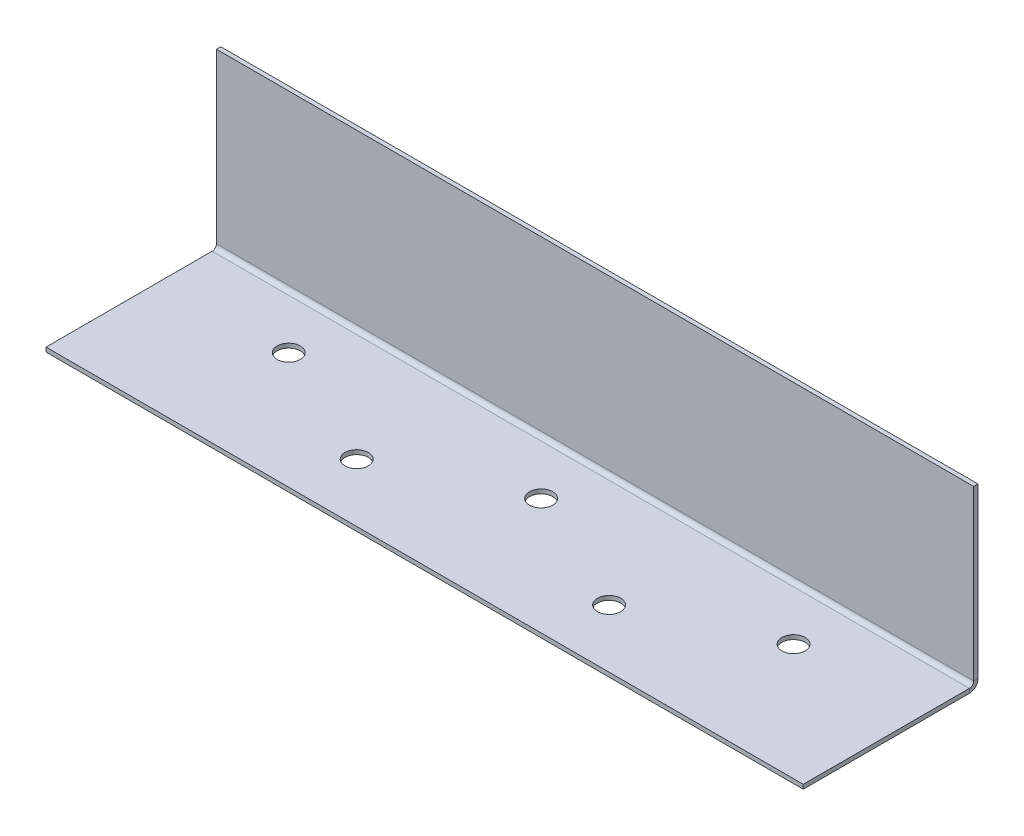
ISO-10303-21;
HEADER;
FILE_DESCRIPTION(('STEP AP214'),'2;1');
FILE_NAME('part.step','',(''),(''),'','','');
FILE_SCHEMA(('AUTOMOTIVE_DESIGN { 1 0 10303 214 1 1 1 1 }'));
ENDSEC;
DATA;
#1=APPLICATION_CONTEXT('core data for automotive mechanical design processes');
#2=APPLICATION_PROTOCOL_DEFINITION('international standard','automotive_design',2000,#1);
#3=PRODUCT_CONTEXT('',#1,'mechanical');
#4=PRODUCT('Part','Part','',(#3));
#5=PRODUCT_RELATED_PRODUCT_CATEGORY('part','',(#4));
#6=PRODUCT_DEFINITION_FORMATION('','',#4);
#7=PRODUCT_DEFINITION_CONTEXT('part definition',#1,'design');
#8=PRODUCT_DEFINITION('design','',#6,#7);
#9=PRODUCT_DEFINITION_SHAPE('','',#8);
#10=(LENGTH_UNIT() NAMED_UNIT(*) SI_UNIT(.MILLI.,.METRE.));
#11=(NAMED_UNIT(*) PLANE_ANGLE_UNIT() SI_UNIT($,.RADIAN.));
#12=(NAMED_UNIT(*) SI_UNIT($,.STERADIAN.) SOLID_ANGLE_UNIT());
#13=UNCERTAINTY_MEASURE_WITH_UNIT(LENGTH_MEASURE(1.E-05),#10,'distance_accuracy_value','');
#14=(GEOMETRIC_REPRESENTATION_CONTEXT(3) GLOBAL_UNCERTAINTY_ASSIGNED_CONTEXT((#13)) GLOBAL_UNIT_ASSIGNED_CONTEXT((#10,
#11,#12)) REPRESENTATION_CONTEXT('',''));
#15=CARTESIAN_POINT('',(0.,0.,0.));
#16=DIRECTION('',(0.,0.,1.));
#17=DIRECTION('',(1.,0.,0.));
#18=AXIS2_PLACEMENT_3D('',#15,#16,#17);
#19=CARTESIAN_POINT('',(-65.,-0.7366,15.));
#20=DIRECTION('',(-1.,0.,0.));
#21=DIRECTION('',(0.,0.,1.));
#22=AXIS2_PLACEMENT_3D('',#19,#20,#21);
#23=PLANE('',#22);
#24=DIRECTION('',(0.,0.,1.));
#25=VECTOR('',#24,1.);
#26=CARTESIAN_POINT('',(-65.,0.,15.));
#27=LINE('',#26,#25);
#28=CARTESIAN_POINT('',(-65.,0.,-13.5268));
#29=VERTEX_POINT('',#28);
#30=CARTESIAN_POINT('',(-65.,0.,15.));
#31=VERTEX_POINT('',#30);
#32=EDGE_CURVE('E105',#29,#31,#27,.T.);
#33=ORIENTED_EDGE('',*,*,#32,.F.);
#34=DIRECTION('',(0.,-1.,0.));
#35=VECTOR('',#34,1.);
#36=CARTESIAN_POINT('',(-65.,0.,-13.5268));
#37=LINE('',#36,#35);
#38=CARTESIAN_POINT('',(-65.,-0.736600000000003,-13.5268));
#39=VERTEX_POINT('',#38);
#40=EDGE_CURVE('E148',#29,#39,#37,.T.);
#41=ORIENTED_EDGE('',*,*,#40,.T.);
#42=DIRECTION('',(0.,0.,1.));
#43=VECTOR('',#42,1.);
#44=CARTESIAN_POINT('',(-65.,-0.7366,15.));
#45=LINE('',#44,#43);
#46=CARTESIAN_POINT('',(-65.,-0.7366,15.));
#47=VERTEX_POINT('',#46);
#48=EDGE_CURVE('E113',#39,#47,#45,.T.);
#49=ORIENTED_EDGE('',*,*,#48,.T.);
#50=DIRECTION('',(0.,1.,0.));
#51=VECTOR('',#50,1.);
#52=CARTESIAN_POINT('',(-65.,-0.7366,15.));
#53=LINE('',#52,#51);
#54=EDGE_CURVE('E61',#47,#31,#53,.T.);
#55=ORIENTED_EDGE('',*,*,#54,.T.);
#56=EDGE_LOOP('',(#33,#41,#49,#55));
#57=FACE_BOUND('',#56,.T.);
#58=ADVANCED_FACE('F57',(#57),#23,.T.);
#59=CARTESIAN_POINT('',(0.,-0.7366,0.));
#60=DIRECTION('',(0.,-1.,0.));
#61=DIRECTION('',(0.,0.,-1.));
#62=AXIS2_PLACEMENT_3D('',#59,#60,#61);
#63=PLANE('',#62);
#64=CARTESIAN_POINT('',(0.,-0.7366,-5.));
#65=DIRECTION('',(0.,1.,0.));
#66=DIRECTION('',(0.,0.,1.));
#67=AXIS2_PLACEMENT_3D('',#64,#65,#66);
#68=CIRCLE('',#67,2.);
#69=CARTESIAN_POINT('',(0.,-0.7366,-3.));
#70=VERTEX_POINT('',#69);
#71=EDGE_CURVE('E106',#70,#70,#68,.T.);
#72=ORIENTED_EDGE('',*,*,#71,.T.);
#73=EDGE_LOOP('',(#72));
#74=FACE_BOUND('',#73,.T.);
#75=CARTESIAN_POINT('',(-21.6666666666667,-0.7366,5.));
#76=DIRECTION('',(0.,1.,0.));
#77=DIRECTION('',(0.,0.,1.));
#78=AXIS2_PLACEMENT_3D('',#75,#76,#77);
#79=CIRCLE('',#78,2.);
#80=CARTESIAN_POINT('',(-21.6666666666667,-0.7366,7.));
#81=VERTEX_POINT('',#80);
#82=EDGE_CURVE('E122',#81,#81,#79,.T.);
#83=ORIENTED_EDGE('',*,*,#82,.T.);
#84=EDGE_LOOP('',(#83));
#85=FACE_BOUND('',#84,.T.);
#86=CARTESIAN_POINT('',(-43.3333333333333,-0.7366,-5.));
#87=DIRECTION('',(0.,1.,0.));
#88=DIRECTION('',(0.,0.,1.));
#89=AXIS2_PLACEMENT_3D('',#86,#87,#88);
#90=CIRCLE('',#89,2.);
#91=CARTESIAN_POINT('',(-43.3333333333333,-0.7366,-3.));
#92=VERTEX_POINT('',#91);
#93=EDGE_CURVE('E128',#92,#92,#90,.T.);
#94=ORIENTED_EDGE('',*,*,#93,.T.);
#95=EDGE_LOOP('',(#94));
#96=FACE_BOUND('',#95,.T.);
#97=CARTESIAN_POINT('',(21.6666666666667,-0.7366,5.));
#98=DIRECTION('',(0.,1.,0.));
#99=DIRECTION('',(0.,0.,1.));
#100=AXIS2_PLACEMENT_3D('',#97,#98,#99);
#101=CIRCLE('',#100,2.);
#102=CARTESIAN_POINT('',(21.6666666666667,-0.7366,7.));
#103=VERTEX_POINT('',#102);
#104=EDGE_CURVE('E134',#103,#103,#101,.T.);
#105=ORIENTED_EDGE('',*,*,#104,.T.);
#106=EDGE_LOOP('',(#105));
#107=FACE_BOUND('',#106,.T.);
#108=CARTESIAN_POINT('',(43.3333333333333,-0.7366,-5.));
#109=DIRECTION('',(0.,1.,0.));
#110=DIRECTION('',(0.,0.,1.));
#111=AXIS2_PLACEMENT_3D('',#108,#109,#110);
#112=CIRCLE('',#111,2.);
#113=CARTESIAN_POINT('',(43.3333333333333,-0.7366,-3.));
#114=VERTEX_POINT('',#113);
#115=EDGE_CURVE('E140',#114,#114,#112,.T.);
#116=ORIENTED_EDGE('',*,*,#115,.T.);
#117=EDGE_LOOP('',(#116));
#118=FACE_BOUND('',#117,.T.);
#119=ORIENTED_EDGE('',*,*,#48,.F.);
#120=DIRECTION('',(-1.,0.,0.));
#121=VECTOR('',#120,1.);
#122=CARTESIAN_POINT('',(-65.,-0.736600000000003,-13.5268));
#123=LINE('',#122,#121);
#124=CARTESIAN_POINT('',(65.,-0.7366,-13.5268));
#125=VERTEX_POINT('',#124);
#126=EDGE_CURVE('E165',#39,#125,#123,.F.);
#127=ORIENTED_EDGE('',*,*,#126,.T.);
#128=DIRECTION('',(0.,0.,-1.));
#129=VECTOR('',#128,1.);
#130=CARTESIAN_POINT('',(65.,-0.7366,15.));
#131=LINE('',#130,#129);
#132=CARTESIAN_POINT('',(65.,-0.7366,15.));
#133=VERTEX_POINT('',#132);
#134=EDGE_CURVE('E111',#133,#125,#131,.T.);
#135=ORIENTED_EDGE('',*,*,#134,.F.);
#136=DIRECTION('',(1.,0.,0.));
#137=VECTOR('',#136,1.);
#138=CARTESIAN_POINT('',(-65.,-0.7366,15.));
#139=LINE('',#138,#137);
#140=EDGE_CURVE('E97',#47,#133,#139,.T.);
#141=ORIENTED_EDGE('',*,*,#140,.F.);
#142=EDGE_LOOP('',(#119,#127,#135,#141));
#143=FACE_BOUND('',#142,.T.);
#144=ADVANCED_FACE('F255',(#74,#85,#96,#107,#118,#143),#63,.T.);
#145=CARTESIAN_POINT('',(0.,0.,0.));
#146=DIRECTION('',(0.,-1.,0.));
#147=DIRECTION('',(0.,0.,-1.));
#148=AXIS2_PLACEMENT_3D('',#145,#146,#147);
#149=PLANE('',#148);
#150=CARTESIAN_POINT('',(0.,0.,-5.));
#151=DIRECTION('',(0.,1.,0.));
#152=DIRECTION('',(0.,0.,1.));
#153=AXIS2_PLACEMENT_3D('',#150,#151,#152);
#154=CIRCLE('',#153,2.);
#155=CARTESIAN_POINT('',(0.,0.,-3.));
#156=VERTEX_POINT('',#155);
#157=EDGE_CURVE('E119',#156,#156,#154,.T.);
#158=ORIENTED_EDGE('',*,*,#157,.F.);
#159=EDGE_LOOP('',(#158));
#160=FACE_BOUND('',#159,.T.);
#161=CARTESIAN_POINT('',(-21.6666666666667,0.,5.));
#162=DIRECTION('',(0.,1.,0.));
#163=DIRECTION('',(0.,0.,1.));
#164=AXIS2_PLACEMENT_3D('',#161,#162,#163);
#165=CIRCLE('',#164,2.);
#166=CARTESIAN_POINT('',(-21.6666666666667,0.,7.));
#167=VERTEX_POINT('',#166);
#168=EDGE_CURVE('E125',#167,#167,#165,.T.);
#169=ORIENTED_EDGE('',*,*,#168,.F.);
#170=EDGE_LOOP('',(#169));
#171=FACE_BOUND('',#170,.T.);
#172=CARTESIAN_POINT('',(-43.3333333333333,0.,-5.));
#173=DIRECTION('',(0.,1.,0.));
#174=DIRECTION('',(0.,0.,1.));
#175=AXIS2_PLACEMENT_3D('',#172,#173,#174);
#176=CIRCLE('',#175,2.);
#177=CARTESIAN_POINT('',(-43.3333333333333,0.,-3.));
#178=VERTEX_POINT('',#177);
#179=EDGE_CURVE('E131',#178,#178,#176,.T.);
#180=ORIENTED_EDGE('',*,*,#179,.F.);
#181=EDGE_LOOP('',(#180));
#182=FACE_BOUND('',#181,.T.);
#183=CARTESIAN_POINT('',(21.6666666666667,0.,5.));
#184=DIRECTION('',(0.,1.,0.));
#185=DIRECTION('',(0.,0.,1.));
#186=AXIS2_PLACEMENT_3D('',#183,#184,#185);
#187=CIRCLE('',#186,2.);
#188=CARTESIAN_POINT('',(21.6666666666667,0.,7.));
#189=VERTEX_POINT('',#188);
#190=EDGE_CURVE('E137',#189,#189,#187,.T.);
#191=ORIENTED_EDGE('',*,*,#190,.F.);
#192=EDGE_LOOP('',(#191));
#193=FACE_BOUND('',#192,.T.);
#194=CARTESIAN_POINT('',(43.3333333333333,0.,-5.));
#195=DIRECTION('',(0.,1.,0.));
#196=DIRECTION('',(0.,0.,1.));
#197=AXIS2_PLACEMENT_3D('',#194,#195,#196);
#198=CIRCLE('',#197,2.);
#199=CARTESIAN_POINT('',(43.3333333333333,0.,-3.));
#200=VERTEX_POINT('',#199);
#201=EDGE_CURVE('E143',#200,#200,#198,.T.);
#202=ORIENTED_EDGE('',*,*,#201,.F.);
#203=EDGE_LOOP('',(#202));
#204=FACE_BOUND('',#203,.T.);
#205=DIRECTION('',(-1.,0.,0.));
#206=VECTOR('',#205,1.);
#207=CARTESIAN_POINT('',(-65.,0.,-13.5268));
#208=LINE('',#207,#206);
#209=CARTESIAN_POINT('',(65.,0.,-13.5268));
#210=VERTEX_POINT('',#209);
#211=EDGE_CURVE('E155',#29,#210,#208,.F.);
#212=ORIENTED_EDGE('',*,*,#211,.F.);
#213=ORIENTED_EDGE('',*,*,#32,.T.);
#214=DIRECTION('',(1.,0.,0.));
#215=VECTOR('',#214,1.);
#216=CARTESIAN_POINT('',(-65.,0.,15.));
#217=LINE('',#216,#215);
#218=CARTESIAN_POINT('',(65.,0.,15.));
#219=VERTEX_POINT('',#218);
#220=EDGE_CURVE('E95',#31,#219,#217,.T.);
#221=ORIENTED_EDGE('',*,*,#220,.T.);
#222=DIRECTION('',(0.,0.,-1.));
#223=VECTOR('',#222,1.);
#224=CARTESIAN_POINT('',(65.,0.,15.));
#225=LINE('',#224,#223);
#226=EDGE_CURVE('E100',#219,#210,#225,.T.);
#227=ORIENTED_EDGE('',*,*,#226,.T.);
#228=EDGE_LOOP('',(#212,#213,#221,#227));
#229=FACE_BOUND('',#228,.T.);
#230=ADVANCED_FACE('F108',(#160,#171,#182,#193,#204,#229),#149,.F.);
#231=CARTESIAN_POINT('',(65.,-0.7366,15.));
#232=DIRECTION('',(1.,0.,0.));
#233=DIRECTION('',(0.,0.,-1.));
#234=AXIS2_PLACEMENT_3D('',#231,#232,#233);
#235=PLANE('',#234);
#236=DIRECTION('',(0.,-1.,0.));
#237=VECTOR('',#236,1.);
#238=CARTESIAN_POINT('',(65.,0.,-13.5268));
#239=LINE('',#238,#237);
#240=EDGE_CURVE('E102',#210,#125,#239,.T.);
#241=ORIENTED_EDGE('',*,*,#240,.F.);
#242=ORIENTED_EDGE('',*,*,#226,.F.);
#243=DIRECTION('',(0.,1.,0.));
#244=VECTOR('',#243,1.);
#245=CARTESIAN_POINT('',(65.,-0.7366,15.));
#246=LINE('',#245,#244);
#247=EDGE_CURVE('E13',#133,#219,#246,.T.);
#248=ORIENTED_EDGE('',*,*,#247,.F.);
#249=ORIENTED_EDGE('',*,*,#134,.T.);
#250=EDGE_LOOP('',(#241,#242,#248,#249));
#251=FACE_BOUND('',#250,.T.);
#252=ADVANCED_FACE('F59',(#251),#235,.T.);
#253=CARTESIAN_POINT('',(-65.,-0.7366,15.));
#254=DIRECTION('',(0.,0.,1.));
#255=DIRECTION('',(1.,0.,0.));
#256=AXIS2_PLACEMENT_3D('',#253,#254,#255);
#257=PLANE('',#256);
#258=ORIENTED_EDGE('',*,*,#220,.F.);
#259=ORIENTED_EDGE('',*,*,#54,.F.);
#260=ORIENTED_EDGE('',*,*,#140,.T.);
#261=ORIENTED_EDGE('',*,*,#247,.T.);
#262=EDGE_LOOP('',(#258,#259,#260,#261));
#263=FACE_BOUND('',#262,.T.);
#264=ADVANCED_FACE('F92',(#263),#257,.T.);
#265=CARTESIAN_POINT('',(0.,-0.7366,-5.));
#266=DIRECTION('',(0.,1.,0.));
#267=DIRECTION('',(0.,0.,1.));
#268=AXIS2_PLACEMENT_3D('',#265,#266,#267);
#269=CYLINDRICAL_SURFACE('',#268,2.);
#270=ORIENTED_EDGE('',*,*,#71,.F.);
#271=EDGE_LOOP('',(#270));
#272=FACE_BOUND('',#271,.T.);
#273=ORIENTED_EDGE('',*,*,#157,.T.);
#274=EDGE_LOOP('',(#273));
#275=FACE_BOUND('',#274,.T.);
#276=ADVANCED_FACE('F279',(#272,#275),#269,.F.);
#277=CARTESIAN_POINT('',(-21.6666666666667,-0.7366,5.));
#278=DIRECTION('',(0.,1.,0.));
#279=DIRECTION('',(0.,0.,1.));
#280=AXIS2_PLACEMENT_3D('',#277,#278,#279);
#281=CYLINDRICAL_SURFACE('',#280,2.);
#282=ORIENTED_EDGE('',*,*,#82,.F.);
#283=EDGE_LOOP('',(#282));
#284=FACE_BOUND('',#283,.T.);
#285=ORIENTED_EDGE('',*,*,#168,.T.);
#286=EDGE_LOOP('',(#285));
#287=FACE_BOUND('',#286,.T.);
#288=ADVANCED_FACE('F285',(#284,#287),#281,.F.);
#289=CARTESIAN_POINT('',(-43.3333333333333,-0.7366,-5.));
#290=DIRECTION('',(0.,1.,0.));
#291=DIRECTION('',(0.,0.,1.));
#292=AXIS2_PLACEMENT_3D('',#289,#290,#291);
#293=CYLINDRICAL_SURFACE('',#292,2.);
#294=ORIENTED_EDGE('',*,*,#93,.F.);
#295=EDGE_LOOP('',(#294));
#296=FACE_BOUND('',#295,.T.);
#297=ORIENTED_EDGE('',*,*,#179,.T.);
#298=EDGE_LOOP('',(#297));
#299=FACE_BOUND('',#298,.T.);
#300=ADVANCED_FACE('F289',(#296,#299),#293,.F.);
#301=CARTESIAN_POINT('',(21.6666666666667,-0.7366,5.));
#302=DIRECTION('',(0.,1.,0.));
#303=DIRECTION('',(0.,0.,1.));
#304=AXIS2_PLACEMENT_3D('',#301,#302,#303);
#305=CYLINDRICAL_SURFACE('',#304,2.);
#306=ORIENTED_EDGE('',*,*,#104,.F.);
#307=EDGE_LOOP('',(#306));
#308=FACE_BOUND('',#307,.T.);
#309=ORIENTED_EDGE('',*,*,#190,.T.);
#310=EDGE_LOOP('',(#309));
#311=FACE_BOUND('',#310,.T.);
#312=ADVANCED_FACE('F266',(#308,#311),#305,.F.);
#313=CARTESIAN_POINT('',(43.3333333333333,-0.7366,-5.));
#314=DIRECTION('',(0.,1.,0.));
#315=DIRECTION('',(0.,0.,1.));
#316=AXIS2_PLACEMENT_3D('',#313,#314,#315);
#317=CYLINDRICAL_SURFACE('',#316,2.);
#318=ORIENTED_EDGE('',*,*,#115,.F.);
#319=EDGE_LOOP('',(#318));
#320=FACE_BOUND('',#319,.T.);
#321=ORIENTED_EDGE('',*,*,#201,.T.);
#322=EDGE_LOOP('',(#321));
#323=FACE_BOUND('',#322,.T.);
#324=ADVANCED_FACE('F259',(#320,#323),#317,.F.);
#325=CARTESIAN_POINT('',(65.,0.736599999999988,-13.5268));
#326=DIRECTION('',(1.,0.,0.));
#327=DIRECTION('',(0.,1.,0.));
#328=AXIS2_PLACEMENT_3D('',#325,#326,#327);
#329=PLANE('',#328);
#330=DIRECTION('',(0.,0.,1.));
#331=VECTOR('',#330,1.);
#332=CARTESIAN_POINT('',(65.,0.736600000000002,-15.));
#333=LINE('',#332,#331);
#334=CARTESIAN_POINT('',(65.,0.736599999999985,-14.2634));
#335=VERTEX_POINT('',#334);
#336=CARTESIAN_POINT('',(65.,0.736599999999983,-15.));
#337=VERTEX_POINT('',#336);
#338=EDGE_CURVE('E169',#335,#337,#333,.F.);
#339=ORIENTED_EDGE('',*,*,#338,.F.);
#340=CARTESIAN_POINT('',(65.,0.736599999999988,-13.5268));
#341=DIRECTION('',(-1.,0.,0.));
#342=DIRECTION('',(0.,-1.,0.));
#343=AXIS2_PLACEMENT_3D('',#340,#341,#342);
#344=CIRCLE('',#343,0.7366);
#345=EDGE_CURVE('E159',#210,#335,#344,.F.);
#346=ORIENTED_EDGE('',*,*,#345,.F.);
#347=ORIENTED_EDGE('',*,*,#240,.T.);
#348=CARTESIAN_POINT('',(65.,0.736599999999988,-13.5268));
#349=DIRECTION('',(-1.,0.,0.));
#350=DIRECTION('',(0.,-1.,0.));
#351=AXIS2_PLACEMENT_3D('',#348,#349,#350);
#352=CIRCLE('',#351,1.4732);
#353=EDGE_CURVE('E72',#125,#337,#352,.F.);
#354=ORIENTED_EDGE('',*,*,#353,.T.);
#355=EDGE_LOOP('',(#339,#346,#347,#354));
#356=FACE_BOUND('',#355,.T.);
#357=ADVANCED_FACE('F257',(#356),#329,.T.);
#358=CARTESIAN_POINT('',(-65.,0.736599999999997,-13.5268));
#359=DIRECTION('',(1.,0.,0.));
#360=DIRECTION('',(0.,1.,0.));
#361=AXIS2_PLACEMENT_3D('',#358,#359,#360);
#362=PLANE('',#361);
#363=CARTESIAN_POINT('',(-65.,0.736599999999997,-13.5268));
#364=DIRECTION('',(-1.,0.,0.));
#365=DIRECTION('',(0.,-1.,0.));
#366=AXIS2_PLACEMENT_3D('',#363,#364,#365);
#367=CIRCLE('',#366,0.7366);
#368=CARTESIAN_POINT('',(-65.,0.736599999999995,-14.2634));
#369=VERTEX_POINT('',#368);
#370=EDGE_CURVE('E152',#369,#29,#367,.T.);
#371=ORIENTED_EDGE('',*,*,#370,.F.);
#372=DIRECTION('',(0.,0.,1.));
#373=VECTOR('',#372,1.);
#374=CARTESIAN_POINT('',(-65.,0.736599999999999,-14.2634));
#375=LINE('',#374,#373);
#376=CARTESIAN_POINT('',(-65.,0.736600000000004,-15.));
#377=VERTEX_POINT('',#376);
#378=EDGE_CURVE('E175',#369,#377,#375,.F.);
#379=ORIENTED_EDGE('',*,*,#378,.T.);
#380=CARTESIAN_POINT('',(-65.,0.736599999999997,-13.5268));
#381=DIRECTION('',(-1.,0.,0.));
#382=DIRECTION('',(0.,-1.,0.));
#383=AXIS2_PLACEMENT_3D('',#380,#381,#382);
#384=CIRCLE('',#383,1.4732);
#385=EDGE_CURVE('E162',#377,#39,#384,.T.);
#386=ORIENTED_EDGE('',*,*,#385,.T.);
#387=ORIENTED_EDGE('',*,*,#40,.F.);
#388=EDGE_LOOP('',(#371,#379,#386,#387));
#389=FACE_BOUND('',#388,.T.);
#390=ADVANCED_FACE('F249',(#389),#362,.F.);
#391=CARTESIAN_POINT('',(-65.,0.736599999999997,-13.5268));
#392=DIRECTION('',(-1.,0.,0.));
#393=DIRECTION('',(0.,0.,-1.));
#394=AXIS2_PLACEMENT_3D('',#391,#392,#393);
#395=CYLINDRICAL_SURFACE('',#394,1.4732);
#396=ORIENTED_EDGE('',*,*,#126,.F.);
#397=ORIENTED_EDGE('',*,*,#385,.F.);
#398=DIRECTION('',(-1.,0.,0.));
#399=VECTOR('',#398,1.);
#400=CARTESIAN_POINT('',(65.,0.736600000000002,-15.));
#401=LINE('',#400,#399);
#402=EDGE_CURVE('E178',#377,#337,#401,.F.);
#403=ORIENTED_EDGE('',*,*,#402,.T.);
#404=ORIENTED_EDGE('',*,*,#353,.F.);
#405=EDGE_LOOP('',(#396,#397,#403,#404));
#406=FACE_BOUND('',#405,.T.);
#407=ADVANCED_FACE('F256',(#406),#395,.T.);
#408=CARTESIAN_POINT('',(-65.,0.736599999999997,-13.5268));
#409=DIRECTION('',(-1.,0.,0.));
#410=DIRECTION('',(0.,0.,-1.));
#411=AXIS2_PLACEMENT_3D('',#408,#409,#410);
#412=CYLINDRICAL_SURFACE('',#411,0.7366);
#413=ORIENTED_EDGE('',*,*,#211,.T.);
#414=ORIENTED_EDGE('',*,*,#345,.T.);
#415=DIRECTION('',(-1.,0.,0.));
#416=VECTOR('',#415,1.);
#417=CARTESIAN_POINT('',(65.,0.736599999999997,-14.2634));
#418=LINE('',#417,#416);
#419=EDGE_CURVE('E172',#335,#369,#418,.T.);
#420=ORIENTED_EDGE('',*,*,#419,.T.);
#421=ORIENTED_EDGE('',*,*,#370,.T.);
#422=EDGE_LOOP('',(#413,#414,#420,#421));
#423=FACE_BOUND('',#422,.T.);
#424=ADVANCED_FACE('F251',(#423),#412,.F.);
#425=CARTESIAN_POINT('',(65.,0.,-15.));
#426=DIRECTION('',(-1.,0.,0.));
#427=DIRECTION('',(0.,-1.,0.));
#428=AXIS2_PLACEMENT_3D('',#425,#426,#427);
#429=PLANE('',#428);
#430=ORIENTED_EDGE('',*,*,#338,.T.);
#431=DIRECTION('',(0.,-1.,0.));
#432=VECTOR('',#431,1.);
#433=CARTESIAN_POINT('',(65.,-1.16061797413528E-13,-15.));
#434=LINE('',#433,#432);
#435=CARTESIAN_POINT('',(65.,29.6534,-15.0000000000001));
#436=VERTEX_POINT('',#435);
#437=EDGE_CURVE('E189',#436,#337,#434,.T.);
#438=ORIENTED_EDGE('',*,*,#437,.F.);
#439=DIRECTION('',(0.,0.,1.));
#440=VECTOR('',#439,1.);
#441=CARTESIAN_POINT('',(65.,29.6534,-15.0000000000001));
#442=LINE('',#441,#440);
#443=CARTESIAN_POINT('',(65.,29.6534,-14.2634000000001));
#444=VERTEX_POINT('',#443);
#445=EDGE_CURVE('E198',#436,#444,#442,.T.);
#446=ORIENTED_EDGE('',*,*,#445,.T.);
#447=DIRECTION('',(0.,1.,0.));
#448=VECTOR('',#447,1.);
#449=CARTESIAN_POINT('',(65.,0.,-14.2634));
#450=LINE('',#449,#448);
#451=EDGE_CURVE('E180',#444,#335,#450,.F.);
#452=ORIENTED_EDGE('',*,*,#451,.T.);
#453=EDGE_LOOP('',(#430,#438,#446,#452));
#454=FACE_BOUND('',#453,.T.);
#455=ADVANCED_FACE('F224',(#454),#429,.F.);
#456=CARTESIAN_POINT('',(-65.,29.6534,-15.0000000000001));
#457=DIRECTION('',(1.,0.,0.));
#458=DIRECTION('',(0.,1.,0.));
#459=AXIS2_PLACEMENT_3D('',#456,#457,#458);
#460=PLANE('',#459);
#461=ORIENTED_EDGE('',*,*,#378,.F.);
#462=DIRECTION('',(0.,-1.,0.));
#463=VECTOR('',#462,1.);
#464=CARTESIAN_POINT('',(-65.,29.6534,-14.2634000000001));
#465=LINE('',#464,#463);
#466=CARTESIAN_POINT('',(-65.,29.6534,-14.2634000000001));
#467=VERTEX_POINT('',#466);
#468=EDGE_CURVE('E183',#369,#467,#465,.F.);
#469=ORIENTED_EDGE('',*,*,#468,.T.);
#470=DIRECTION('',(0.,0.,1.));
#471=VECTOR('',#470,1.);
#472=CARTESIAN_POINT('',(-65.,29.6534,-15.0000000000001));
#473=LINE('',#472,#471);
#474=CARTESIAN_POINT('',(-65.,29.6534,-15.0000000000001));
#475=VERTEX_POINT('',#474);
#476=EDGE_CURVE('E156',#475,#467,#473,.T.);
#477=ORIENTED_EDGE('',*,*,#476,.F.);
#478=DIRECTION('',(0.,1.,0.));
#479=VECTOR('',#478,1.);
#480=CARTESIAN_POINT('',(-65.,0.,-15.));
#481=LINE('',#480,#479);
#482=EDGE_CURVE('E192',#377,#475,#481,.T.);
#483=ORIENTED_EDGE('',*,*,#482,.F.);
#484=EDGE_LOOP('',(#461,#469,#477,#483));
#485=FACE_BOUND('',#484,.T.);
#486=ADVANCED_FACE('F246',(#485),#460,.F.);
#487=CARTESIAN_POINT('',(0.,0.,-15.));
#488=DIRECTION('',(0.,0.,1.));
#489=DIRECTION('',(0.,-1.,0.));
#490=AXIS2_PLACEMENT_3D('',#487,#488,#489);
#491=PLANE('',#490);
#492=ORIENTED_EDGE('',*,*,#402,.F.);
#493=ORIENTED_EDGE('',*,*,#482,.T.);
#494=DIRECTION('',(1.,0.,0.));
#495=VECTOR('',#494,1.);
#496=CARTESIAN_POINT('',(0.,29.6534,-15.0000000000001));
#497=LINE('',#496,#495);
#498=EDGE_CURVE('E195',#475,#436,#497,.T.);
#499=ORIENTED_EDGE('',*,*,#498,.T.);
#500=ORIENTED_EDGE('',*,*,#437,.T.);
#501=EDGE_LOOP('',(#492,#493,#499,#500));
#502=FACE_BOUND('',#501,.T.);
#503=ADVANCED_FACE('F244',(#502),#491,.F.);
#504=CARTESIAN_POINT('',(0.,0.,-14.2634));
#505=DIRECTION('',(0.,0.,1.));
#506=DIRECTION('',(0.,-1.,0.));
#507=AXIS2_PLACEMENT_3D('',#504,#505,#506);
#508=PLANE('',#507);
#509=ORIENTED_EDGE('',*,*,#468,.F.);
#510=ORIENTED_EDGE('',*,*,#419,.F.);
#511=ORIENTED_EDGE('',*,*,#451,.F.);
#512=DIRECTION('',(-1.,0.,0.));
#513=VECTOR('',#512,1.);
#514=CARTESIAN_POINT('',(65.,29.6534,-14.2634000000001));
#515=LINE('',#514,#513);
#516=EDGE_CURVE('E186',#467,#444,#515,.F.);
#517=ORIENTED_EDGE('',*,*,#516,.F.);
#518=EDGE_LOOP('',(#509,#510,#511,#517));
#519=FACE_BOUND('',#518,.T.);
#520=ADVANCED_FACE('F218',(#519),#508,.T.);
#521=CARTESIAN_POINT('',(65.,29.6534,-15.0000000000001));
#522=DIRECTION('',(0.,-1.,0.));
#523=DIRECTION('',(0.,0.,-1.));
#524=AXIS2_PLACEMENT_3D('',#521,#522,#523);
#525=PLANE('',#524);
#526=ORIENTED_EDGE('',*,*,#516,.T.);
#527=ORIENTED_EDGE('',*,*,#445,.F.);
#528=ORIENTED_EDGE('',*,*,#498,.F.);
#529=ORIENTED_EDGE('',*,*,#476,.T.);
#530=EDGE_LOOP('',(#526,#527,#528,#529));
#531=FACE_BOUND('',#530,.T.);
#532=ADVANCED_FACE('F207',(#531),#525,.F.);
#533=CLOSED_SHELL('',(#58,#144,#230,#252,#264,#276,#288,#300,#312,#324,#357,#390,#407,#424,#455,
#486,#503,#520,#532));
#534=MANIFOLD_SOLID_BREP('B2',#533);
#535=ADVANCED_BREP_SHAPE_REPRESENTATION('',(#18,#534),#14);
#536=SHAPE_DEFINITION_REPRESENTATION(#9,#535);
ENDSEC;
END-ISO-10303-21;
